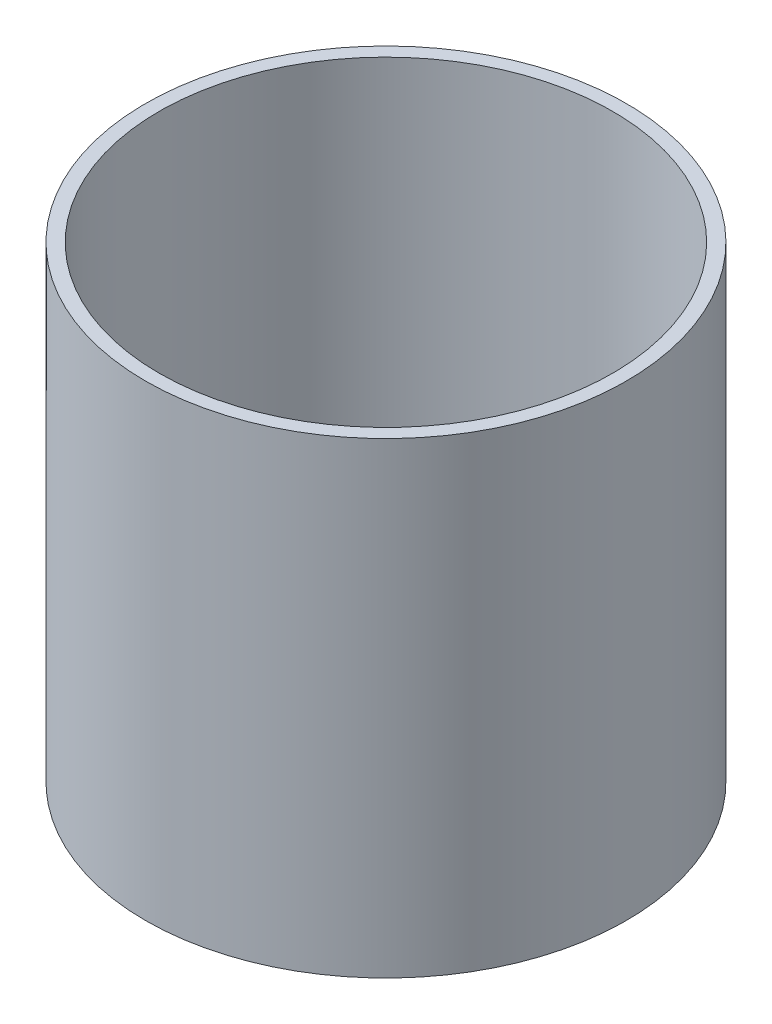
ISO-10303-21;
HEADER;
FILE_DESCRIPTION(('STEP AP214'),'2;1');
FILE_NAME('part.step','',(''),(''),'','','');
FILE_SCHEMA(('AUTOMOTIVE_DESIGN { 1 0 10303 214 1 1 1 1 }'));
ENDSEC;
DATA;
#1=APPLICATION_CONTEXT('core data for automotive mechanical design processes');
#2=APPLICATION_PROTOCOL_DEFINITION('international standard','automotive_design',2000,#1);
#3=PRODUCT_CONTEXT('',#1,'mechanical');
#4=PRODUCT('Part','Part','',(#3));
#5=PRODUCT_RELATED_PRODUCT_CATEGORY('part','',(#4));
#6=PRODUCT_DEFINITION_FORMATION('','',#4);
#7=PRODUCT_DEFINITION_CONTEXT('part definition',#1,'design');
#8=PRODUCT_DEFINITION('design','',#6,#7);
#9=PRODUCT_DEFINITION_SHAPE('','',#8);
#10=(LENGTH_UNIT() NAMED_UNIT(*) SI_UNIT(.MILLI.,.METRE.));
#11=(NAMED_UNIT(*) PLANE_ANGLE_UNIT() SI_UNIT($,.RADIAN.));
#12=(NAMED_UNIT(*) SI_UNIT($,.STERADIAN.) SOLID_ANGLE_UNIT());
#13=UNCERTAINTY_MEASURE_WITH_UNIT(LENGTH_MEASURE(1.E-05),#10,'distance_accuracy_value','');
#14=(GEOMETRIC_REPRESENTATION_CONTEXT(3) GLOBAL_UNCERTAINTY_ASSIGNED_CONTEXT((#13)) GLOBAL_UNIT_ASSIGNED_CONTEXT((#10,
#11,#12)) REPRESENTATION_CONTEXT('',''));
#15=CARTESIAN_POINT('',(0.,0.,0.));
#16=DIRECTION('',(0.,0.,1.));
#17=DIRECTION('',(1.,0.,0.));
#18=AXIS2_PLACEMENT_3D('',#15,#16,#17);
#19=CARTESIAN_POINT('',(-21.6509836038174,103.,-19.0528655713593));
#20=DIRECTION('',(0.,-1.,0.));
#21=DIRECTION('',(0.,0.,-1.));
#22=AXIS2_PLACEMENT_3D('',#19,#20,#21);
#23=CYLINDRICAL_SURFACE('',#22,53.);
#24=CARTESIAN_POINT('',(-21.6509836038174,103.,-19.0528655713593));
#25=DIRECTION('',(0.,1.,0.));
#26=DIRECTION('',(0.,0.,1.));
#27=AXIS2_PLACEMENT_3D('',#24,#25,#26);
#28=CIRCLE('',#27,53.);
#29=CARTESIAN_POINT('',(-21.6509836038174,103.,33.9471344286407));
#30=VERTEX_POINT('',#29);
#31=EDGE_CURVE('E10',#30,#30,#28,.T.);
#32=ORIENTED_EDGE('',*,*,#31,.F.);
#33=EDGE_LOOP('',(#32));
#34=FACE_BOUND('',#33,.T.);
#35=CARTESIAN_POINT('',(-21.6509836038174,0.,-19.0528655713593));
#36=DIRECTION('',(0.,1.,0.));
#37=DIRECTION('',(0.,0.,1.));
#38=AXIS2_PLACEMENT_3D('',#35,#36,#37);
#39=CIRCLE('',#38,53.);
#40=CARTESIAN_POINT('',(-21.6509836038174,0.,33.9471344286407));
#41=VERTEX_POINT('',#40);
#42=EDGE_CURVE('E37',#41,#41,#39,.T.);
#43=ORIENTED_EDGE('',*,*,#42,.T.);
#44=EDGE_LOOP('',(#43));
#45=FACE_BOUND('',#44,.T.);
#46=ADVANCED_FACE('F40',(#34,#45),#23,.T.);
#47=CARTESIAN_POINT('',(-21.6509836038174,103.,-19.0528655713593));
#48=DIRECTION('',(0.,1.,0.));
#49=DIRECTION('',(0.,0.,1.));
#50=AXIS2_PLACEMENT_3D('',#47,#48,#49);
#51=PLANE('',#50);
#52=CARTESIAN_POINT('',(-21.6509836038174,103.,-19.0528655713593));
#53=DIRECTION('',(0.,1.,0.));
#54=DIRECTION('',(0.,0.,1.));
#55=AXIS2_PLACEMENT_3D('',#52,#53,#54);
#56=CIRCLE('',#55,50.);
#57=CARTESIAN_POINT('',(-21.6509836038174,103.,30.9471344286407));
#58=VERTEX_POINT('',#57);
#59=EDGE_CURVE('E47',#58,#58,#56,.T.);
#60=ORIENTED_EDGE('',*,*,#59,.F.);
#61=EDGE_LOOP('',(#60));
#62=FACE_BOUND('',#61,.T.);
#63=ORIENTED_EDGE('',*,*,#31,.T.);
#64=EDGE_LOOP('',(#63));
#65=FACE_BOUND('',#64,.T.);
#66=ADVANCED_FACE('F65',(#62,#65),#51,.T.);
#67=CARTESIAN_POINT('',(-21.6509836038174,0.,-19.0528655713593));
#68=DIRECTION('',(0.,1.,0.));
#69=DIRECTION('',(0.,0.,1.));
#70=AXIS2_PLACEMENT_3D('',#67,#68,#69);
#71=PLANE('',#70);
#72=ORIENTED_EDGE('',*,*,#42,.F.);
#73=EDGE_LOOP('',(#72));
#74=FACE_BOUND('',#73,.T.);
#75=ADVANCED_FACE('F58',(#74),#71,.F.);
#76=CARTESIAN_POINT('',(-21.6509836038174,2.99999999999999,-19.0528655713593));
#77=DIRECTION('',(0.,1.,0.));
#78=DIRECTION('',(0.,0.,1.));
#79=AXIS2_PLACEMENT_3D('',#76,#77,#78);
#80=CYLINDRICAL_SURFACE('',#79,50.);
#81=CARTESIAN_POINT('',(-21.6509836038174,2.99999999999999,-19.0528655713593));
#82=DIRECTION('',(0.,1.,0.));
#83=DIRECTION('',(0.,0.,1.));
#84=AXIS2_PLACEMENT_3D('',#81,#82,#83);
#85=CIRCLE('',#84,50.);
#86=CARTESIAN_POINT('',(-21.6509836038174,2.99999999999999,30.9471344286407));
#87=VERTEX_POINT('',#86);
#88=EDGE_CURVE('E50',#87,#87,#85,.T.);
#89=ORIENTED_EDGE('',*,*,#88,.F.);
#90=EDGE_LOOP('',(#89));
#91=FACE_BOUND('',#90,.T.);
#92=ORIENTED_EDGE('',*,*,#59,.T.);
#93=EDGE_LOOP('',(#92));
#94=FACE_BOUND('',#93,.T.);
#95=ADVANCED_FACE('F60',(#91,#94),#80,.F.);
#96=CARTESIAN_POINT('',(-21.6509836038174,2.99999999999999,-19.0528655713593));
#97=DIRECTION('',(0.,1.,0.));
#98=DIRECTION('',(0.,0.,1.));
#99=AXIS2_PLACEMENT_3D('',#96,#97,#98);
#100=PLANE('',#99);
#101=ORIENTED_EDGE('',*,*,#88,.T.);
#102=EDGE_LOOP('',(#101));
#103=FACE_BOUND('',#102,.T.);
#104=ADVANCED_FACE('F54',(#103),#100,.T.);
#105=CLOSED_SHELL('',(#46,#66,#75,#95,#104));
#106=MANIFOLD_SOLID_BREP('B2',#105);
#107=ADVANCED_BREP_SHAPE_REPRESENTATION('',(#18,#106),#14);
#108=SHAPE_DEFINITION_REPRESENTATION(#9,#107);
ENDSEC;
END-ISO-10303-21;
